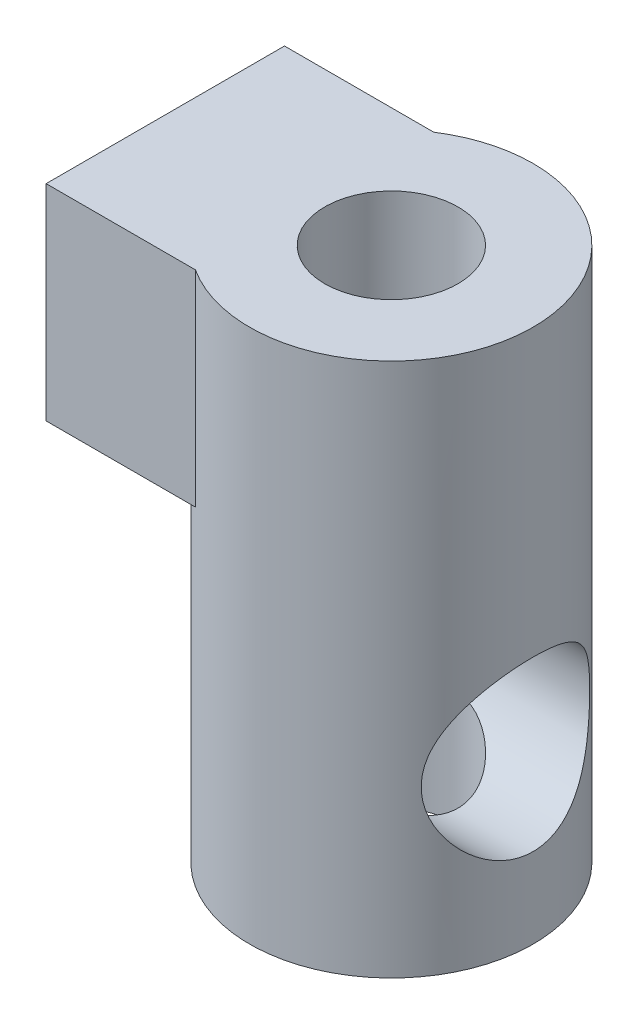
ISO-10303-21;
HEADER;
FILE_DESCRIPTION(('STEP AP214'),'2;1');
FILE_NAME('part.step','',(''),(''),'','','');
FILE_SCHEMA(('AUTOMOTIVE_DESIGN { 1 0 10303 214 1 1 1 1 }'));
ENDSEC;
DATA;
#1=APPLICATION_CONTEXT('core data for automotive mechanical design processes');
#2=APPLICATION_PROTOCOL_DEFINITION('international standard','automotive_design',2000,#1);
#3=PRODUCT_CONTEXT('',#1,'mechanical');
#4=PRODUCT('Part','Part','',(#3));
#5=PRODUCT_RELATED_PRODUCT_CATEGORY('part','',(#4));
#6=PRODUCT_DEFINITION_FORMATION('','',#4);
#7=PRODUCT_DEFINITION_CONTEXT('part definition',#1,'design');
#8=PRODUCT_DEFINITION('design','',#6,#7);
#9=PRODUCT_DEFINITION_SHAPE('','',#8);
#10=(LENGTH_UNIT() NAMED_UNIT(*) SI_UNIT(.MILLI.,.METRE.));
#11=(NAMED_UNIT(*) PLANE_ANGLE_UNIT() SI_UNIT($,.RADIAN.));
#12=(NAMED_UNIT(*) SI_UNIT($,.STERADIAN.) SOLID_ANGLE_UNIT());
#13=UNCERTAINTY_MEASURE_WITH_UNIT(LENGTH_MEASURE(1.E-05),#10,'distance_accuracy_value','');
#14=(GEOMETRIC_REPRESENTATION_CONTEXT(3) GLOBAL_UNCERTAINTY_ASSIGNED_CONTEXT((#13)) GLOBAL_UNIT_ASSIGNED_CONTEXT((#10,
#11,#12)) REPRESENTATION_CONTEXT('',''));
#15=CARTESIAN_POINT('',(0.,0.,0.));
#16=DIRECTION('',(0.,0.,1.));
#17=DIRECTION('',(1.,0.,0.));
#18=AXIS2_PLACEMENT_3D('',#15,#16,#17);
#19=CARTESIAN_POINT('',(-5.5,13.,2.9));
#20=DIRECTION('',(1.,0.,0.));
#21=DIRECTION('',(0.,1.,0.));
#22=AXIS2_PLACEMENT_3D('',#19,#20,#21);
#23=PLANE('',#22);
#24=DIRECTION('',(0.,1.,0.));
#25=VECTOR('',#24,1.);
#26=CARTESIAN_POINT('',(-5.5,0.,2.9));
#27=LINE('',#26,#25);
#28=CARTESIAN_POINT('',(-5.5,13.,2.9));
#29=VERTEX_POINT('',#28);
#30=CARTESIAN_POINT('',(-5.5,8.,2.9));
#31=VERTEX_POINT('',#30);
#32=EDGE_CURVE('E93',#29,#31,#27,.F.);
#33=ORIENTED_EDGE('',*,*,#32,.F.);
#34=DIRECTION('',(0.,0.,1.));
#35=VECTOR('',#34,1.);
#36=CARTESIAN_POINT('',(-5.5,13.,0.));
#37=LINE('',#36,#35);
#38=CARTESIAN_POINT('',(-5.5,13.,-2.9));
#39=VERTEX_POINT('',#38);
#40=EDGE_CURVE('E99',#39,#29,#37,.T.);
#41=ORIENTED_EDGE('',*,*,#40,.F.);
#42=DIRECTION('',(0.,1.,0.));
#43=VECTOR('',#42,1.);
#44=CARTESIAN_POINT('',(-5.5,0.,-2.9));
#45=LINE('',#44,#43);
#46=CARTESIAN_POINT('',(-5.5,8.,-2.9));
#47=VERTEX_POINT('',#46);
#48=EDGE_CURVE('E105',#39,#47,#45,.F.);
#49=ORIENTED_EDGE('',*,*,#48,.T.);
#50=DIRECTION('',(0.,0.,1.));
#51=VECTOR('',#50,1.);
#52=CARTESIAN_POINT('',(-5.5,8.,2.9));
#53=LINE('',#52,#51);
#54=EDGE_CURVE('E104',#47,#31,#53,.T.);
#55=ORIENTED_EDGE('',*,*,#54,.T.);
#56=EDGE_LOOP('',(#33,#41,#49,#55));
#57=FACE_BOUND('',#56,.T.);
#58=ADVANCED_FACE('F49',(#57),#23,.F.);
#59=CARTESIAN_POINT('',(0.,0.,0.));
#60=DIRECTION('',(0.,-1.,0.));
#61=DIRECTION('',(0.,0.,-1.));
#62=AXIS2_PLACEMENT_3D('',#59,#60,#61);
#63=CYLINDRICAL_SURFACE('',#62,1.621);
#64=CARTESIAN_POINT('',(0.,2.74506613720085,-1.621));
#65=CARTESIAN_POINT('',(-0.0618838344943444,2.74507314784713,-1.62100303795965));
#66=CARTESIAN_POINT('',(-0.123753923437036,2.74041001839376,-1.61742580648904));
#67=CARTESIAN_POINT('',(-0.245548077429936,2.72269820526634,-1.60347159765317));
#68=CARTESIAN_POINT('',(-0.305467583498045,2.70963117787796,-1.59307974460996));
#69=CARTESIAN_POINT('',(-0.441855724366991,2.67167549543974,-1.56167676736126));
#70=CARTESIAN_POINT('',(-0.517049098267742,2.64428105756333,-1.53826004055569));
#71=CARTESIAN_POINT('',(-0.661104506712128,2.58308809869082,-1.48209063959145));
#72=CARTESIAN_POINT('',(-0.729947369344123,2.54927107144414,-1.44931084533742));
#73=CARTESIAN_POINT('',(-0.883849864405583,2.46687093643185,-1.36260863239398));
#74=CARTESIAN_POINT('',(-0.966412860188457,2.41719066792417,-1.3052891068616));
#75=CARTESIAN_POINT('',(-1.11998184477946,2.31899579598461,-1.17614619810124));
#76=CARTESIAN_POINT('',(-1.19099722423979,2.2704802730153,-1.10433470749768));
#77=CARTESIAN_POINT('',(-1.30741448004819,2.1881341644896,-0.961795820520631));
#78=CARTESIAN_POINT('',(-1.35511379821205,2.15327812500301,-0.89354450203995));
#79=CARTESIAN_POINT('',(-1.44036943977302,2.08983985144661,-0.748356083631551));
#80=CARTESIAN_POINT('',(-1.47794136722123,2.06124797856644,-0.671432607974437));
#81=CARTESIAN_POINT('',(-1.53603227948987,2.01657637847978,-0.523019292399699));
#82=CARTESIAN_POINT('',(-1.5583110113087,1.99923126755153,-0.452603469122463));
#83=CARTESIAN_POINT('',(-1.5931987923943,1.97194135411511,-0.308021253672216));
#84=CARTESIAN_POINT('',(-1.60581302820809,1.96199258237375,-0.233856896000057));
#85=CARTESIAN_POINT('',(-1.62060784053911,1.95031520563182,-0.0835898288305419));
#86=CARTESIAN_POINT('',(-1.622754232398,1.94861353315467,-0.00748158339559628));
#87=CARTESIAN_POINT('',(-1.61637011622946,1.95365995743185,0.144000645385217));
#88=CARTESIAN_POINT('',(-1.60783889419273,1.96040861925788,0.219374579288185));
#89=CARTESIAN_POINT('',(-1.58137378064278,1.98120338027809,0.363292111490304));
#90=CARTESIAN_POINT('',(-1.56394382245725,1.99485804086783,0.431987821527844));
#91=CARTESIAN_POINT('',(-1.52089453282525,2.02825075136374,0.565176319537256));
#92=CARTESIAN_POINT('',(-1.4952731758384,2.04799030587785,0.629668063213476));
#93=CARTESIAN_POINT('',(-1.43398336321787,2.0945524951873,0.759600226458337));
#94=CARTESIAN_POINT('',(-1.39757254510311,2.12188213081783,0.824505291232971));
#95=CARTESIAN_POINT('',(-1.31735169849772,2.18078779889944,0.94742878237488));
#96=CARTESIAN_POINT('',(-1.27353705925498,2.21236647494132,1.00544287879559));
#97=CARTESIAN_POINT('',(-1.16981404388338,2.28487045121659,1.12547688073274));
#98=CARTESIAN_POINT('',(-1.10844780214715,2.32638463810277,1.18587950931886));
#99=CARTESIAN_POINT('',(-0.977264585306865,2.41023794800863,1.29612932641368));
#100=CARTESIAN_POINT('',(-0.907439330850794,2.45257784464318,1.34596604009144));
#101=CARTESIAN_POINT('',(-0.768475362298799,2.5294639393179,1.42927834909955));
#102=CARTESIAN_POINT('',(-0.700266704048141,2.56433465569014,1.46400152188266));
#103=CARTESIAN_POINT('',(-0.557319490299985,2.6283607645284,1.5241485765311));
#104=CARTESIAN_POINT('',(-0.482590989710123,2.65752474030309,1.54958647471164));
#105=CARTESIAN_POINT('',(-0.340404375629608,2.70115287710556,1.58624516610801));
#106=CARTESIAN_POINT('',(-0.273922199255208,2.71728655323593,1.59916336038962));
#107=CARTESIAN_POINT('',(-0.138281246217461,2.73922227563148,1.61652514107857));
#108=CARTESIAN_POINT('',(-0.0691320460858539,2.74505830542494,1.62099660621602));
#109=CARTESIAN_POINT('',(0.0618838344943545,2.74507314784709,1.62100303795965));
#110=CARTESIAN_POINT('',(0.123753923437046,2.74041001839375,1.61742580648904));
#111=CARTESIAN_POINT('',(0.245548077429942,2.72269820526635,1.60347159765317));
#112=CARTESIAN_POINT('',(0.305467583498048,2.70963117787797,1.59307974460996));
#113=CARTESIAN_POINT('',(0.44185572436699,2.67167549543974,1.56167676736126));
#114=CARTESIAN_POINT('',(0.51704909826774,2.64428105756332,1.53826004055569));
#115=CARTESIAN_POINT('',(0.661104506712126,2.58308809869082,1.48209063959145));
#116=CARTESIAN_POINT('',(0.729947369344122,2.54927107144414,1.44931084533743));
#117=CARTESIAN_POINT('',(0.883849864405583,2.46687093643185,1.36260863239398));
#118=CARTESIAN_POINT('',(0.966412860188457,2.41719066792417,1.3052891068616));
#119=CARTESIAN_POINT('',(1.11998184477946,2.31899579598461,1.17614619810124));
#120=CARTESIAN_POINT('',(1.19099722423979,2.2704802730153,1.10433470749768));
#121=CARTESIAN_POINT('',(1.30741448004819,2.1881341644896,0.961795820520632));
#122=CARTESIAN_POINT('',(1.35511379821205,2.15327812500301,0.893544502039951));
#123=CARTESIAN_POINT('',(1.44036943977302,2.08983985144661,0.748356083631551));
#124=CARTESIAN_POINT('',(1.47794136722123,2.06124797856644,0.671432607974438));
#125=CARTESIAN_POINT('',(1.53603227948987,2.01657637847978,0.523019292399699));
#126=CARTESIAN_POINT('',(1.5583110113087,1.99923126755153,0.452603469122464));
#127=CARTESIAN_POINT('',(1.5931987923943,1.97194135411511,0.308021253672216));
#128=CARTESIAN_POINT('',(1.60581302820809,1.96199258237375,0.233856896000058));
#129=CARTESIAN_POINT('',(1.62060784053911,1.95031520563182,0.0835898288305418));
#130=CARTESIAN_POINT('',(1.622754232398,1.94861353315467,0.00748158339559626));
#131=CARTESIAN_POINT('',(1.61637011622946,1.95365995743185,-0.144000645385217));
#132=CARTESIAN_POINT('',(1.60783889419273,1.96040861925788,-0.219374579288185));
#133=CARTESIAN_POINT('',(1.58137378064278,1.98120338027809,-0.363292111490305));
#134=CARTESIAN_POINT('',(1.56394382245725,1.99485804086783,-0.431987821527845));
#135=CARTESIAN_POINT('',(1.52089453282525,2.02825075136374,-0.565176319537257));
#136=CARTESIAN_POINT('',(1.4952731758384,2.04799030587785,-0.629668063213477));
#137=CARTESIAN_POINT('',(1.43398336321787,2.0945524951873,-0.759600226458337));
#138=CARTESIAN_POINT('',(1.39757254510311,2.12188213081783,-0.824505291232972));
#139=CARTESIAN_POINT('',(1.31735169849772,2.18078779889944,-0.94742878237488));
#140=CARTESIAN_POINT('',(1.27353705925498,2.21236647494132,-1.00544287879559));
#141=CARTESIAN_POINT('',(1.16981404388338,2.28487045121659,-1.12547688073274));
#142=CARTESIAN_POINT('',(1.10844780214715,2.32638463810277,-1.18587950931886));
#143=CARTESIAN_POINT('',(0.977264585306865,2.41023794800863,-1.29612932641368));
#144=CARTESIAN_POINT('',(0.907439330850794,2.45257784464318,-1.34596604009144));
#145=CARTESIAN_POINT('',(0.768475362298799,2.5294639393179,-1.42927834909955));
#146=CARTESIAN_POINT('',(0.700266704048141,2.56433465569014,-1.46400152188266));
#147=CARTESIAN_POINT('',(0.557319490299986,2.6283607645284,-1.5241485765311));
#148=CARTESIAN_POINT('',(0.482590989710123,2.65752474030309,-1.54958647471164));
#149=CARTESIAN_POINT('',(0.340404375629609,2.70115287710556,-1.58624516610801));
#150=CARTESIAN_POINT('',(0.273922199255209,2.71728655323592,-1.59916336038962));
#151=CARTESIAN_POINT('',(0.138281246217465,2.73922227563149,-1.61652514107857));
#152=CARTESIAN_POINT('',(0.0691320460858616,2.74505830542497,-1.62099660621601));
#153=CARTESIAN_POINT('',(0.,2.74506613720085,-1.621));
#154=B_SPLINE_CURVE_WITH_KNOTS('',3,(#64,#65,#66,#67,#68,#69,#70,#71,#72,#73,#74,#75,#76,#77,
#78,#79,#80,#81,#82,#83,#84,#85,#86,#87,#88,#89,#90,#91,#92,#93,#94,#95,#96,#97,#98,#99,#100,
#101,#102,#103,#104,#105,#106,#107,#108,#109,#110,#111,#112,#113,#114,#115,#116,#117,#118,#119,
#120,#121,#122,#123,#124,#125,#126,#127,#128,#129,#130,#131,#132,#133,#134,#135,#136,#137,#138,
#139,#140,#141,#142,#143,#144,#145,#146,#147,#148,#149,#150,#151,#152,#153),.UNSPECIFIED.,.T.,
.F.,(4,2,2,2,2,2,2,2,2,2,2,2,2,2,2,2,2,2,2,2,2,2,2,2,2,2,2,2,2,2,2,2,2,2,2,2,2,2,2,2,2,2,2,2,4),
(0.,0.185377660843626,0.371161336779442,0.619921094874963,0.869408821243559,1.20414561890691,
1.53860882854341,1.80839015749153,2.07775340616949,2.30438341449147,2.53089171422933,
2.75813922518544,2.98540193293617,3.20102541609755,3.41670225917006,3.6536797749335,
3.89080541674557,4.17654691448938,4.46257037937714,4.71414744690372,4.96534316757062,
5.17312037153082,5.38021059303127,5.56558825387489,5.7513719298107,6.00013168790622,
6.24961941427482,6.58435621193817,6.91881942157467,7.18860075052279,7.45796399920074,
7.68459400752272,7.91110230726059,8.1383498182167,8.36561252596742,8.58123600912881,
8.79691285220132,9.03389036796475,9.27101600977683,9.55675750752064,9.8427809724084,
10.094358039935,10.3455537606019,10.5533309645621,10.7604211860625),.UNSPECIFIED.);
#155=CARTESIAN_POINT('',(0.,2.74506613720085,-1.621));
#156=VERTEX_POINT('',#155);
#157=EDGE_CURVE('E52',#156,#156,#154,.T.);
#158=ORIENTED_EDGE('',*,*,#157,.T.);
#159=EDGE_LOOP('',(#158));
#160=FACE_BOUND('',#159,.T.);
#161=CARTESIAN_POINT('',(0.,0.,0.));
#162=DIRECTION('',(0.,-1.,0.));
#163=DIRECTION('',(0.,0.,-1.));
#164=AXIS2_PLACEMENT_3D('',#161,#162,#163);
#165=CIRCLE('',#164,1.621);
#166=CARTESIAN_POINT('',(0.,0.,-1.621));
#167=VERTEX_POINT('',#166);
#168=EDGE_CURVE('E123',#167,#167,#165,.T.);
#169=ORIENTED_EDGE('',*,*,#168,.T.);
#170=EDGE_LOOP('',(#169));
#171=FACE_BOUND('',#170,.T.);
#172=ADVANCED_FACE('F183',(#160,#171),#63,.F.);
#173=CARTESIAN_POINT('',(0.,0.,2.9));
#174=DIRECTION('',(0.,0.,1.));
#175=DIRECTION('',(1.,0.,0.));
#176=AXIS2_PLACEMENT_3D('',#173,#174,#175);
#177=PLANE('',#176);
#178=DIRECTION('',(0.,-1.,0.));
#179=VECTOR('',#178,1.);
#180=CARTESIAN_POINT('',(-1.86882315910308,13.,2.9));
#181=LINE('',#180,#179);
#182=CARTESIAN_POINT('',(-1.86882315910308,13.,2.9));
#183=VERTEX_POINT('',#182);
#184=CARTESIAN_POINT('',(-1.86882315910308,8.,2.9));
#185=VERTEX_POINT('',#184);
#186=EDGE_CURVE('E122',#183,#185,#181,.T.);
#187=ORIENTED_EDGE('',*,*,#186,.F.);
#188=DIRECTION('',(1.,0.,0.));
#189=VECTOR('',#188,1.);
#190=CARTESIAN_POINT('',(0.,13.,2.9));
#191=LINE('',#190,#189);
#192=EDGE_CURVE('E110',#29,#183,#191,.T.);
#193=ORIENTED_EDGE('',*,*,#192,.F.);
#194=ORIENTED_EDGE('',*,*,#32,.T.);
#195=DIRECTION('',(1.,0.,0.));
#196=VECTOR('',#195,1.);
#197=CARTESIAN_POINT('',(-5.5,8.,2.9));
#198=LINE('',#197,#196);
#199=EDGE_CURVE('E83',#31,#185,#198,.T.);
#200=ORIENTED_EDGE('',*,*,#199,.T.);
#201=EDGE_LOOP('',(#187,#193,#194,#200));
#202=FACE_BOUND('',#201,.T.);
#203=ADVANCED_FACE('F109',(#202),#177,.T.);
#204=CARTESIAN_POINT('',(-5.5,8.,2.9));
#205=DIRECTION('',(0.,1.,0.));
#206=DIRECTION('',(0.,0.,1.));
#207=AXIS2_PLACEMENT_3D('',#204,#205,#206);
#208=PLANE('',#207);
#209=ORIENTED_EDGE('',*,*,#199,.F.);
#210=ORIENTED_EDGE('',*,*,#54,.F.);
#211=DIRECTION('',(1.,0.,0.));
#212=VECTOR('',#211,1.);
#213=CARTESIAN_POINT('',(0.,8.,-2.9));
#214=LINE('',#213,#212);
#215=CARTESIAN_POINT('',(-1.86882315910308,8.,-2.9));
#216=VERTEX_POINT('',#215);
#217=EDGE_CURVE('E117',#47,#216,#214,.T.);
#218=ORIENTED_EDGE('',*,*,#217,.T.);
#219=CARTESIAN_POINT('',(0.,8.,0.));
#220=DIRECTION('',(0.,-1.,0.));
#221=DIRECTION('',(0.,0.,-1.));
#222=AXIS2_PLACEMENT_3D('',#219,#220,#221);
#223=CIRCLE('',#222,3.45);
#224=EDGE_CURVE('E115',#185,#216,#223,.T.);
#225=ORIENTED_EDGE('',*,*,#224,.F.);
#226=EDGE_LOOP('',(#209,#210,#218,#225));
#227=FACE_BOUND('',#226,.T.);
#228=ADVANCED_FACE('F113',(#227),#208,.F.);
#229=CARTESIAN_POINT('',(0.,0.,-2.9));
#230=DIRECTION('',(0.,0.,1.));
#231=DIRECTION('',(1.,0.,0.));
#232=AXIS2_PLACEMENT_3D('',#229,#230,#231);
#233=PLANE('',#232);
#234=ORIENTED_EDGE('',*,*,#217,.F.);
#235=ORIENTED_EDGE('',*,*,#48,.F.);
#236=DIRECTION('',(1.,0.,0.));
#237=VECTOR('',#236,1.);
#238=CARTESIAN_POINT('',(0.,13.,-2.9));
#239=LINE('',#238,#237);
#240=CARTESIAN_POINT('',(-1.86882315910308,13.,-2.9));
#241=VERTEX_POINT('',#240);
#242=EDGE_CURVE('E175',#241,#39,#239,.F.);
#243=ORIENTED_EDGE('',*,*,#242,.F.);
#244=DIRECTION('',(0.,-1.,0.));
#245=VECTOR('',#244,1.);
#246=CARTESIAN_POINT('',(-1.86882315910308,13.,-2.9));
#247=LINE('',#246,#245);
#248=EDGE_CURVE('E177',#216,#241,#247,.F.);
#249=ORIENTED_EDGE('',*,*,#248,.F.);
#250=EDGE_LOOP('',(#234,#235,#243,#249));
#251=FACE_BOUND('',#250,.T.);
#252=ADVANCED_FACE('F162',(#251),#233,.F.);
#253=CARTESIAN_POINT('',(-3.45,4.,0.));
#254=DIRECTION('',(1.,0.,0.));
#255=DIRECTION('',(0.,0.,-1.));
#256=AXIS2_PLACEMENT_3D('',#253,#254,#255);
#257=CYLINDRICAL_SURFACE('',#256,2.05);
#258=CARTESIAN_POINT('',(0.,5.25493386279916,1.62099999999999));
#259=CARTESIAN_POINT('',(-0.061883033049549,5.25492889918169,1.62100214032641));
#260=CARTESIAN_POINT('',(-0.123755996479579,5.25959073995909,1.61742540841188));
#261=CARTESIAN_POINT('',(-0.245551219828907,5.27730179462163,1.60347139817653));
#262=CARTESIAN_POINT('',(-0.30546900533672,5.29036899863706,1.59307953238345));
#263=CARTESIAN_POINT('',(-0.441854610423959,5.32832448802651,1.56167686966186));
#264=CARTESIAN_POINT('',(-0.517047347609583,5.35571839087183,1.53826053845071));
#265=CARTESIAN_POINT('',(-0.661103028524226,5.41691108038444,1.48209140158255));
#266=CARTESIAN_POINT('',(-0.729946653059148,5.45072851563303,1.44931126805409));
#267=CARTESIAN_POINT('',(-0.883850180507783,5.53312927228377,1.36260842856593));
#268=CARTESIAN_POINT('',(-0.966413492435413,5.58280972225945,1.30528866079276));
#269=CARTESIAN_POINT('',(-1.11998239987942,5.68100457275356,1.17614564592379));
#270=CARTESIAN_POINT('',(-1.19099747457449,5.72951990147346,1.10433440354057));
#271=CARTESIAN_POINT('',(-1.30741442747507,5.8118658004062,0.961795882835193));
#272=CARTESIAN_POINT('',(-1.35511370389337,5.84672180667136,0.893544636434797));
#273=CARTESIAN_POINT('',(-1.44036936613832,5.91016009190644,0.748356235158539));
#274=CARTESIAN_POINT('',(-1.4779413362639,5.93875199748061,0.671432687310931));
#275=CARTESIAN_POINT('',(-1.53603229081255,5.98342363035093,0.523019263265586));
#276=CARTESIAN_POINT('',(-1.55831103038849,6.00076874732406,0.452603408683053));
#277=CARTESIAN_POINT('',(-1.59319880325188,6.02805865442715,0.308021190085523));
#278=CARTESIAN_POINT('',(-1.60581303133965,6.03800742010654,0.233856863808264));
#279=CARTESIAN_POINT('',(-1.6206078367329,6.0496847913554,0.0835898678755997));
#280=CARTESIAN_POINT('',(-1.62275423035395,6.0513864651685,0.00748166244067007));
#281=CARTESIAN_POINT('',(-1.616370124903,6.04634004948564,-0.144000567138135));
#282=CARTESIAN_POINT('',(-1.60783890077889,6.03959138617865,-0.21937454107455));
#283=CARTESIAN_POINT('',(-1.58137378012163,6.01879661906433,-0.363292116599426));
#284=CARTESIAN_POINT('',(-1.56394382140614,6.00514195739511,-0.431987831327662));
#285=CARTESIAN_POINT('',(-1.52089452760981,5.97174924550825,-0.565176329128339));
#286=CARTESIAN_POINT('',(-1.49527316817564,5.95200969156516,-0.629668068517935));
#287=CARTESIAN_POINT('',(-1.43398316810272,5.90544735299585,-0.759600652116186));
#288=CARTESIAN_POINT('',(-1.39757211222425,5.87811753048299,-0.824506101761588));
#289=CARTESIAN_POINT('',(-1.31735112292729,5.81921179934006,-0.947429516871564));
#290=CARTESIAN_POINT('',(-1.27353667123426,5.78763330016539,-1.00544323928693));
#291=CARTESIAN_POINT('',(-1.16981732669034,5.71513178767887,-1.12547318838376));
#292=CARTESIAN_POINT('',(-1.10845512396213,5.67362009730251,-1.18587266023303));
#293=CARTESIAN_POINT('',(-0.977271968834751,5.58976671268696,-1.29612381826176));
#294=CARTESIAN_POINT('',(-0.907441796666578,5.54742415661406,-1.34596384240431));
#295=CARTESIAN_POINT('',(-0.768454020406526,5.47052369220059,-1.42929177700902));
#296=CARTESIAN_POINT('',(-0.700224043684187,5.4356417709281,-1.46402500173882));
#297=CARTESIAN_POINT('',(-0.557261588228809,5.37161775450909,-1.52416742519672));
#298=CARTESIAN_POINT('',(-0.482543855505317,5.34246311004278,-1.54959711730513));
#299=CARTESIAN_POINT('',(-0.3488371866511,5.30143295920477,-1.58407209628777));
#300=CARTESIAN_POINT('',(-0.291322382051614,5.28700429614235,-1.59571297827185));
#301=CARTESIAN_POINT('',(-0.174053268851574,5.26564342969819,-1.61271180043318));
#302=CARTESIAN_POINT('',(-0.114303858671364,5.2586957218473,-1.61808273718418));
#303=CARTESIAN_POINT('',(0.00610377366413646,5.25350316750355,-1.62211120435333));
#304=CARTESIAN_POINT('',(0.0667649395882279,5.25529918211992,-1.62073721417151));
#305=CARTESIAN_POINT('',(0.186743463703107,5.26733881274003,-1.61133604094995));
#306=CARTESIAN_POINT('',(0.246058688971207,5.27759498939371,-1.60329896525788));
#307=CARTESIAN_POINT('',(0.378029533759794,5.3086510349792,-1.57810805759646));
#308=CARTESIAN_POINT('',(0.449797430601424,5.33159241834356,-1.55903801762583));
#309=CARTESIAN_POINT('',(0.587877981473662,5.38432475684989,-1.51241015736106));
#310=CARTESIAN_POINT('',(0.654174078509454,5.41413553515476,-1.48482769286972));
#311=CARTESIAN_POINT('',(0.807953506978126,5.49046420986335,-1.40889626274167));
#312=CARTESIAN_POINT('',(0.89265594334417,5.53874411889626,-1.35668986630306));
#313=CARTESIAN_POINT('',(1.05111007655166,5.63578929914672,-1.23798499705547));
#314=CARTESIAN_POINT('',(1.12485035324314,5.68455502083611,-1.17147179373758));
#315=CARTESIAN_POINT('',(1.26089163408736,5.77827631797998,-1.02370473941556));
#316=CARTESIAN_POINT('',(1.32307401507183,5.82319007901757,-0.942313406154192));
#317=CARTESIAN_POINT('',(1.43228266169034,5.9039303077775,-0.766070062745339));
#318=CARTESIAN_POINT('',(1.47935885986475,5.93978662887907,-0.671263923785083));
#319=CARTESIAN_POINT('',(1.54261773466839,5.98853499246691,-0.503220178930186));
#320=CARTESIAN_POINT('',(1.5638679604424,6.00510346159556,-0.432938636689425));
#321=CARTESIAN_POINT('',(1.59676230394664,6.03086230537072,-0.288851051988581));
#322=CARTESIAN_POINT('',(1.60841361450421,6.04005820442156,-0.215047692512681));
#323=CARTESIAN_POINT('',(1.62140422788307,6.05031577543763,-0.0657382658470275));
#324=CARTESIAN_POINT('',(1.62271209859861,6.05135265335801,0.00977229260505802));
#325=CARTESIAN_POINT('',(1.61484481788687,6.04513496258799,0.159901550024474));
#326=CARTESIAN_POINT('',(1.60566812622582,6.0378791756643,0.234520116326395));
#327=CARTESIAN_POINT('',(1.57803936732592,6.01618411472832,0.377509343320892));
#328=CARTESIAN_POINT('',(1.56000044842438,6.00206508275369,0.446010733770843));
#329=CARTESIAN_POINT('',(1.51579057609565,5.96781229907152,0.578720243658588));
#330=CARTESIAN_POINT('',(1.48961756773055,5.94767702751408,0.642927273213235));
#331=CARTESIAN_POINT('',(1.42708423145257,5.90025501239669,0.772511008436384));
#332=CARTESIAN_POINT('',(1.38994864417285,5.87244300789281,0.837317804438033));
#333=CARTESIAN_POINT('',(1.30827504950294,5.81264140107754,0.959944811141948));
#334=CARTESIAN_POINT('',(1.2637321230162,5.78064902569327,1.01776033468806));
#335=CARTESIAN_POINT('',(1.15829718368978,5.70727405147842,1.13736467721005));
#336=CARTESIAN_POINT('',(1.09592944450333,5.66531836035746,1.19749944593213));
#337=CARTESIAN_POINT('',(0.962663407540082,5.58079323638569,1.30704831575405));
#338=CARTESIAN_POINT('',(0.89175737698168,5.53822327839336,1.35645258342963));
#339=CARTESIAN_POINT('',(0.752359411390864,5.46218916203854,1.43775553281014));
#340=CARTESIAN_POINT('',(0.684976630172156,5.42829414723995,1.47114807536486));
#341=CARTESIAN_POINT('',(0.543932986788265,5.36628181427758,1.52890945878704));
#342=CARTESIAN_POINT('',(0.470282855947681,5.3381548905017,1.55329335696118));
#343=CARTESIAN_POINT('',(0.330952795152718,5.29646665225007,1.58817023124629));
#344=CARTESIAN_POINT('',(0.266239164139942,5.28119135627848,1.60037755212961));
#345=CARTESIAN_POINT('',(0.134341167077994,5.2604420451946,1.61677950974833));
#346=CARTESIAN_POINT('',(0.0671646526277056,5.25493925005358,1.62099767700008));
#347=CARTESIAN_POINT('',(0.,5.25493386279916,1.62099999999999));
#348=B_SPLINE_CURVE_WITH_KNOTS('',3,(#258,#259,#260,#261,#262,#263,#264,#265,#266,#267,#268,
#269,#270,#271,#272,#273,#274,#275,#276,#277,#278,#279,#280,#281,#282,#283,#284,#285,#286,#287,
#288,#289,#290,#291,#292,#293,#294,#295,#296,#297,#298,#299,#300,#301,#302,#303,#304,#305,#306,
#307,#308,#309,#310,#311,#312,#313,#314,#315,#316,#317,#318,#319,#320,#321,#322,#323,#324,#325,
#326,#327,#328,#329,#330,#331,#332,#333,#334,#335,#336,#337,#338,#339,#340,#341,#342,#343,#344,
#345,#346,#347),.UNSPECIFIED.,.T.,.F.,(4,2,2,2,2,2,2,2,2,2,2,2,2,2,2,2,2,2,2,2,2,2,2,2,2,2,2,2,
2,2,2,2,2,2,2,2,2,2,2,2,2,2,2,2,4),(0.,0.185381616549972,0.371161334490022,0.619918309503557,
0.869408821531492,1.20414690848627,1.53860882897815,1.80838989326253,2.07775340646692,
2.30438351163773,2.53089171455724,2.75813910800171,2.98540193327238,3.20102543208312,
3.41670225950147,3.6536812612653,3.89080541659522,4.17653093149088,4.46257038034193,
4.71423568196704,4.9653432410954,5.14594567536399,5.32617308175894,5.50724353198713,
5.68858329913331,5.92044827887146,6.15299092654559,6.48309963883761,6.81354987714127,
7.14722406649036,7.47978367546371,7.70466158107009,7.92937082356064,8.15476266111802,
8.38018761410257,8.59597889835669,8.81182474294718,9.05006699291498,9.28846809225648,
9.57620848530387,9.86421146121221,10.1109589542016,10.3572921402497,10.5590910762084,
10.7602947222735),.UNSPECIFIED.);
#349=CARTESIAN_POINT('',(0.,5.25493386279916,1.62099999999999));
#350=VERTEX_POINT('',#349);
#351=EDGE_CURVE('E111',#350,#350,#348,.T.);
#352=ORIENTED_EDGE('',*,*,#351,.F.);
#353=EDGE_LOOP('',(#352));
#354=FACE_BOUND('',#353,.T.);
#355=CARTESIAN_POINT('',(-2.77488738510232,4.,2.05));
#356=CARTESIAN_POINT('',(-2.77489143393681,3.89663578491721,2.04999751277487));
#357=CARTESIAN_POINT('',(-2.78075382388587,3.79325437500086,2.04212997172924));
#358=CARTESIAN_POINT('',(-2.80319095394179,3.58994792576057,2.01120947430331));
#359=CARTESIAN_POINT('',(-2.81977869035129,3.49002723488545,1.98813809421198));
#360=CARTESIAN_POINT('',(-2.86099956660419,3.29702527173235,1.92833464247161));
#361=CARTESIAN_POINT('',(-2.88557503963835,3.20390066769099,1.89170023193819));
#362=CARTESIAN_POINT('',(-2.93990031601834,3.02517778436712,1.80611491729768));
#363=CARTESIAN_POINT('',(-2.96965169787961,2.93958181314335,1.75716025379903));
#364=CARTESIAN_POINT('',(-3.03528078749033,2.7671024794558,1.6414925013206));
#365=CARTESIAN_POINT('',(-3.07146557480204,2.68129069370902,1.57335539137369));
#366=CARTESIAN_POINT('',(-3.14341900615699,2.52142663611085,1.42417854055656));
#367=CARTESIAN_POINT('',(-3.17918733183335,2.44738287522702,1.3431295455101));
#368=CARTESIAN_POINT('',(-3.2507454613309,2.30545318258062,1.16007998696332));
#369=CARTESIAN_POINT('',(-3.28614148760711,2.23903504295877,1.0567721935483));
#370=CARTESIAN_POINT('',(-3.34861893795642,2.12502685242944,0.837945244070723));
#371=CARTESIAN_POINT('',(-3.37570778937931,2.07741997153734,0.722437121164436));
#372=CARTESIAN_POINT('',(-3.41623599660832,2.00716061371986,0.493963332768772));
#373=CARTESIAN_POINT('',(-3.43071920770604,1.98258277834576,0.381779664167375));
#374=CARTESIAN_POINT('',(-3.44844472323343,1.95258064813637,0.15404091057593));
#375=CARTESIAN_POINT('',(-3.45169733581108,1.94713878901676,0.0384890154691252));
#376=CARTESIAN_POINT('',(-3.44691481696331,1.95519688732065,-0.1775459264577));
#377=CARTESIAN_POINT('',(-3.44020504576054,1.96647253351257,-0.278151654723405));
#378=CARTESIAN_POINT('',(-3.41848665906978,2.00343417951739,-0.475736996500932));
#379=CARTESIAN_POINT('',(-3.40347743245066,2.02912124051813,-0.572716342422266));
#380=CARTESIAN_POINT('',(-3.36634053642459,2.09396822032481,-0.761287110846904));
#381=CARTESIAN_POINT('',(-3.34416736999643,2.13321436417511,-0.852839547639698));
#382=CARTESIAN_POINT('',(-3.2944893894688,2.22374246175478,-1.02818050469654));
#383=CARTESIAN_POINT('',(-3.26698314463927,2.27502764603403,-1.11196693260147));
#384=CARTESIAN_POINT('',(-3.20515249271778,2.39502128496743,-1.28001118436979));
#385=CARTESIAN_POINT('',(-3.17040647450803,2.46507266408615,-1.36315408489345));
#386=CARTESIAN_POINT('',(-3.0996413791566,2.61713706063045,-1.51721046681026));
#387=CARTESIAN_POINT('',(-3.06362066198332,2.69916594617044,-1.58810744818468));
#388=CARTESIAN_POINT('',(-2.98963648835672,2.88380968978909,-1.72371128858937));
#389=CARTESIAN_POINT('',(-2.95191066711962,2.98770239727529,-1.78682336885537));
#390=CARTESIAN_POINT('',(-2.88410862163228,3.20699389859274,-1.89432845584547));
#391=CARTESIAN_POINT('',(-2.85401817581997,3.32237073552277,-1.93875636651866));
#392=CARTESIAN_POINT('',(-2.81275685809301,3.53167775826355,-1.99796367759949));
#393=CARTESIAN_POINT('',(-2.79873407253478,3.62373335929514,-2.01738359688765));
#394=CARTESIAN_POINT('',(-2.77980209532251,3.81052303228283,-2.0433964025447));
#395=CARTESIAN_POINT('',(-2.77488367385963,3.90525429265861,-2.05000227984031));
#396=CARTESIAN_POINT('',(-2.77489143393681,4.10336421508279,-2.04999751277487));
#397=CARTESIAN_POINT('',(-2.78075382388587,4.20674562499914,-2.04212997172924));
#398=CARTESIAN_POINT('',(-2.80319095394179,4.41005207423943,-2.01120947430331));
#399=CARTESIAN_POINT('',(-2.81977869035129,4.50997276511455,-1.98813809421198));
#400=CARTESIAN_POINT('',(-2.86099956660419,4.70297472826765,-1.92833464247161));
#401=CARTESIAN_POINT('',(-2.88557503963835,4.79609933230901,-1.89170023193819));
#402=CARTESIAN_POINT('',(-2.93990031601834,4.97482221563288,-1.80611491729768));
#403=CARTESIAN_POINT('',(-2.96965169787961,5.06041818685665,-1.75716025379903));
#404=CARTESIAN_POINT('',(-3.03528078749033,5.2328975205442,-1.6414925013206));
#405=CARTESIAN_POINT('',(-3.07146557480204,5.31870930629098,-1.57335539137369));
#406=CARTESIAN_POINT('',(-3.14341900615699,5.47857336388915,-1.42417854055656));
#407=CARTESIAN_POINT('',(-3.17918733183335,5.55261712477298,-1.3431295455101));
#408=CARTESIAN_POINT('',(-3.2507454613309,5.69454681741938,-1.16007998696332));
#409=CARTESIAN_POINT('',(-3.28614148760711,5.76096495704123,-1.0567721935483));
#410=CARTESIAN_POINT('',(-3.34861893795642,5.87497314757056,-0.837945244070723));
#411=CARTESIAN_POINT('',(-3.37570778937931,5.92258002846266,-0.722437121164437));
#412=CARTESIAN_POINT('',(-3.41623599660832,5.99283938628014,-0.493963332768773));
#413=CARTESIAN_POINT('',(-3.43071920770604,6.01741722165424,-0.381779664167376));
#414=CARTESIAN_POINT('',(-3.44844472323343,6.04741935186363,-0.15404091057593));
#415=CARTESIAN_POINT('',(-3.45169733581108,6.05286121098324,-0.0384890154691254));
#416=CARTESIAN_POINT('',(-3.44691481696331,6.04480311267935,0.1775459264577));
#417=CARTESIAN_POINT('',(-3.44020504576054,6.03352746648743,0.278151654723405));
#418=CARTESIAN_POINT('',(-3.41848665906978,5.99656582048261,0.475736996500931));
#419=CARTESIAN_POINT('',(-3.40347743245066,5.97087875948187,0.572716342422265));
#420=CARTESIAN_POINT('',(-3.36634053642459,5.90603177967519,0.761287110846903));
#421=CARTESIAN_POINT('',(-3.34416736999643,5.86678563582489,0.852839547639697));
#422=CARTESIAN_POINT('',(-3.2944893894688,5.77625753824522,1.02818050469654));
#423=CARTESIAN_POINT('',(-3.26698314463927,5.72497235396597,1.11196693260147));
#424=CARTESIAN_POINT('',(-3.20515249271778,5.60497871503257,1.28001118436979));
#425=CARTESIAN_POINT('',(-3.17040647450803,5.53492733591385,1.36315408489345));
#426=CARTESIAN_POINT('',(-3.0996413791566,5.38286293936956,1.51721046681026));
#427=CARTESIAN_POINT('',(-3.06362066198332,5.30083405382956,1.58810744818468));
#428=CARTESIAN_POINT('',(-2.98963648835672,5.11619031021091,1.72371128858937));
#429=CARTESIAN_POINT('',(-2.95191066711962,5.01229760272471,1.78682336885537));
#430=CARTESIAN_POINT('',(-2.88410862163228,4.79300610140726,1.89432845584547));
#431=CARTESIAN_POINT('',(-2.85401817581997,4.67762926447723,1.93875636651866));
#432=CARTESIAN_POINT('',(-2.81275685809301,4.46832224173645,1.99796367759949));
#433=CARTESIAN_POINT('',(-2.79873407253478,4.37626664070486,2.01738359688765));
#434=CARTESIAN_POINT('',(-2.77980209532251,4.18947696771717,2.0433964025447));
#435=CARTESIAN_POINT('',(-2.77488367385963,4.09474570734139,2.05000227984031));
#436=CARTESIAN_POINT('',(-2.77488738510232,4.,2.05));
#437=B_SPLINE_CURVE_WITH_KNOTS('',3,(#355,#356,#357,#358,#359,#360,#361,#362,#363,#364,#365,
#366,#367,#368,#369,#370,#371,#372,#373,#374,#375,#376,#377,#378,#379,#380,#381,#382,#383,#384,
#385,#386,#387,#388,#389,#390,#391,#392,#393,#394,#395,#396,#397,#398,#399,#400,#401,#402,#403,
#404,#405,#406,#407,#408,#409,#410,#411,#412,#413,#414,#415,#416,#417,#418,#419,#420,#421,#422,
#423,#424,#425,#426,#427,#428,#429,#430,#431,#432,#433,#434,#435,#436),.UNSPECIFIED.,.T.,.F.,(4,
2,2,2,2,2,2,2,2,2,2,2,2,2,2,2,2,2,2,2,2,2,2,2,2,2,2,2,2,2,2,2,2,2,2,2,2,2,2,2,4),(0.,
0.309689114216517,0.619754195345794,0.92762873895306,1.23559734128545,1.58041776661659,
1.9254864519965,2.30686498648646,2.68790153390397,3.03311352973234,3.37800858397734,
3.68093596068288,3.9838856464437,4.28879843546481,4.59379313834417,4.93483887836356,
5.27634061466023,5.65627826045167,6.03550295651628,6.31965842273558,6.60352566014335,
6.91321477435987,7.22327985548914,7.53115439909641,7.8391230014288,8.18394342675994,
8.52901211213985,8.91039064662981,9.29142719404732,9.63663918987569,9.98153424412068,
10.2844616208262,10.5874113065871,10.8923240956082,11.1973187984875,11.5383645385069,
11.8798662748036,12.259803920595,12.6390286166596,12.9231840828789,13.2070513202867),.UNSPECIFIED.);
#438=CARTESIAN_POINT('',(-2.77488738510232,4.,2.05));
#439=VERTEX_POINT('',#438);
#440=EDGE_CURVE('E134',#439,#439,#437,.T.);
#441=ORIENTED_EDGE('',*,*,#440,.F.);
#442=EDGE_LOOP('',(#441));
#443=FACE_BOUND('',#442,.T.);
#444=CARTESIAN_POINT('',(2.77488738510232,4.,-2.05));
#445=CARTESIAN_POINT('',(2.77489143393681,3.89663578491721,-2.04999751277487));
#446=CARTESIAN_POINT('',(2.78075382388587,3.79325437500086,-2.04212997172924));
#447=CARTESIAN_POINT('',(2.80319095394179,3.58994792576057,-2.01120947430331));
#448=CARTESIAN_POINT('',(2.81977869035129,3.49002723488545,-1.98813809421198));
#449=CARTESIAN_POINT('',(2.86099956660419,3.29702527173235,-1.92833464247161));
#450=CARTESIAN_POINT('',(2.88557503963835,3.20390066769099,-1.89170023193819));
#451=CARTESIAN_POINT('',(2.93990031601834,3.02517778436712,-1.80611491729768));
#452=CARTESIAN_POINT('',(2.96965169787961,2.93958181314335,-1.75716025379903));
#453=CARTESIAN_POINT('',(3.03528078749033,2.7671024794558,-1.6414925013206));
#454=CARTESIAN_POINT('',(3.07146557480204,2.68129069370902,-1.57335539137369));
#455=CARTESIAN_POINT('',(3.14341900615699,2.52142663611085,-1.42417854055656));
#456=CARTESIAN_POINT('',(3.17918733183335,2.44738287522702,-1.3431295455101));
#457=CARTESIAN_POINT('',(3.2507454613309,2.30545318258062,-1.16007998696332));
#458=CARTESIAN_POINT('',(3.28614148760711,2.23903504295877,-1.0567721935483));
#459=CARTESIAN_POINT('',(3.34861893795642,2.12502685242944,-0.837945244070723));
#460=CARTESIAN_POINT('',(3.37570778937931,2.07741997153734,-0.722437121164436));
#461=CARTESIAN_POINT('',(3.41623599660832,2.00716061371986,-0.493963332768772));
#462=CARTESIAN_POINT('',(3.43071920770604,1.98258277834576,-0.381779664167375));
#463=CARTESIAN_POINT('',(3.44844472323343,1.95258064813637,-0.15404091057593));
#464=CARTESIAN_POINT('',(3.45169733581108,1.94713878901676,-0.0384890154691252));
#465=CARTESIAN_POINT('',(3.44691481696331,1.95519688732065,0.1775459264577));
#466=CARTESIAN_POINT('',(3.44020504576054,1.96647253351257,0.278151654723405));
#467=CARTESIAN_POINT('',(3.41848665906978,2.00343417951739,0.475736996500932));
#468=CARTESIAN_POINT('',(3.40347743245066,2.02912124051813,0.572716342422266));
#469=CARTESIAN_POINT('',(3.36634053642459,2.09396822032481,0.761287110846904));
#470=CARTESIAN_POINT('',(3.34416736999643,2.13321436417511,0.852839547639698));
#471=CARTESIAN_POINT('',(3.2944893894688,2.22374246175478,1.02818050469654));
#472=CARTESIAN_POINT('',(3.26698314463927,2.27502764603403,1.11196693260147));
#473=CARTESIAN_POINT('',(3.20515249271778,2.39502128496743,1.28001118436979));
#474=CARTESIAN_POINT('',(3.17040647450803,2.46507266408615,1.36315408489345));
#475=CARTESIAN_POINT('',(3.0996413791566,2.61713706063045,1.51721046681026));
#476=CARTESIAN_POINT('',(3.06362066198332,2.69916594617044,1.58810744818468));
#477=CARTESIAN_POINT('',(2.98963648835672,2.88380968978909,1.72371128858937));
#478=CARTESIAN_POINT('',(2.95191066711962,2.98770239727529,1.78682336885537));
#479=CARTESIAN_POINT('',(2.88410862163228,3.20699389859274,1.89432845584547));
#480=CARTESIAN_POINT('',(2.85401817581997,3.32237073552277,1.93875636651866));
#481=CARTESIAN_POINT('',(2.81275685809301,3.53167775826355,1.99796367759949));
#482=CARTESIAN_POINT('',(2.79873407253478,3.62373335929514,2.01738359688765));
#483=CARTESIAN_POINT('',(2.77980209532251,3.81052303228283,2.0433964025447));
#484=CARTESIAN_POINT('',(2.77488367385963,3.90525429265861,2.05000227984031));
#485=CARTESIAN_POINT('',(2.77489143393681,4.10336421508279,2.04999751277487));
#486=CARTESIAN_POINT('',(2.78075382388587,4.20674562499914,2.04212997172924));
#487=CARTESIAN_POINT('',(2.80319095394179,4.41005207423943,2.01120947430331));
#488=CARTESIAN_POINT('',(2.81977869035129,4.50997276511455,1.98813809421198));
#489=CARTESIAN_POINT('',(2.86099956660419,4.70297472826765,1.92833464247161));
#490=CARTESIAN_POINT('',(2.88557503963835,4.79609933230901,1.89170023193819));
#491=CARTESIAN_POINT('',(2.93990031601834,4.97482221563288,1.80611491729768));
#492=CARTESIAN_POINT('',(2.96965169787961,5.06041818685665,1.75716025379903));
#493=CARTESIAN_POINT('',(3.03528078749033,5.2328975205442,1.6414925013206));
#494=CARTESIAN_POINT('',(3.07146557480204,5.31870930629098,1.57335539137369));
#495=CARTESIAN_POINT('',(3.14341900615699,5.47857336388915,1.42417854055656));
#496=CARTESIAN_POINT('',(3.17918733183335,5.55261712477298,1.3431295455101));
#497=CARTESIAN_POINT('',(3.2507454613309,5.69454681741938,1.16007998696332));
#498=CARTESIAN_POINT('',(3.28614148760711,5.76096495704123,1.0567721935483));
#499=CARTESIAN_POINT('',(3.34861893795642,5.87497314757056,0.837945244070723));
#500=CARTESIAN_POINT('',(3.37570778937931,5.92258002846266,0.722437121164437));
#501=CARTESIAN_POINT('',(3.41623599660832,5.99283938628014,0.493963332768773));
#502=CARTESIAN_POINT('',(3.43071920770604,6.01741722165424,0.381779664167376));
#503=CARTESIAN_POINT('',(3.44844472323343,6.04741935186363,0.15404091057593));
#504=CARTESIAN_POINT('',(3.45169733581108,6.05286121098324,0.0384890154691254));
#505=CARTESIAN_POINT('',(3.44691481696331,6.04480311267935,-0.1775459264577));
#506=CARTESIAN_POINT('',(3.44020504576054,6.03352746648743,-0.278151654723405));
#507=CARTESIAN_POINT('',(3.41848665906978,5.99656582048261,-0.475736996500931));
#508=CARTESIAN_POINT('',(3.40347743245066,5.97087875948187,-0.572716342422265));
#509=CARTESIAN_POINT('',(3.36634053642459,5.90603177967519,-0.761287110846903));
#510=CARTESIAN_POINT('',(3.34416736999643,5.86678563582489,-0.852839547639697));
#511=CARTESIAN_POINT('',(3.2944893894688,5.77625753824522,-1.02818050469654));
#512=CARTESIAN_POINT('',(3.26698314463927,5.72497235396597,-1.11196693260147));
#513=CARTESIAN_POINT('',(3.20515249271778,5.60497871503257,-1.28001118436979));
#514=CARTESIAN_POINT('',(3.17040647450803,5.53492733591385,-1.36315408489345));
#515=CARTESIAN_POINT('',(3.0996413791566,5.38286293936956,-1.51721046681026));
#516=CARTESIAN_POINT('',(3.06362066198332,5.30083405382956,-1.58810744818468));
#517=CARTESIAN_POINT('',(2.98963648835672,5.11619031021091,-1.72371128858937));
#518=CARTESIAN_POINT('',(2.95191066711962,5.01229760272471,-1.78682336885537));
#519=CARTESIAN_POINT('',(2.88410862163228,4.79300610140726,-1.89432845584547));
#520=CARTESIAN_POINT('',(2.85401817581997,4.67762926447723,-1.93875636651866));
#521=CARTESIAN_POINT('',(2.81275685809301,4.46832224173645,-1.99796367759949));
#522=CARTESIAN_POINT('',(2.79873407253478,4.37626664070486,-2.01738359688765));
#523=CARTESIAN_POINT('',(2.77980209532251,4.18947696771717,-2.0433964025447));
#524=CARTESIAN_POINT('',(2.77488367385963,4.09474570734139,-2.05000227984031));
#525=CARTESIAN_POINT('',(2.77488738510232,4.,-2.05));
#526=B_SPLINE_CURVE_WITH_KNOTS('',3,(#444,#445,#446,#447,#448,#449,#450,#451,#452,#453,#454,
#455,#456,#457,#458,#459,#460,#461,#462,#463,#464,#465,#466,#467,#468,#469,#470,#471,#472,#473,
#474,#475,#476,#477,#478,#479,#480,#481,#482,#483,#484,#485,#486,#487,#488,#489,#490,#491,#492,
#493,#494,#495,#496,#497,#498,#499,#500,#501,#502,#503,#504,#505,#506,#507,#508,#509,#510,#511,
#512,#513,#514,#515,#516,#517,#518,#519,#520,#521,#522,#523,#524,#525),.UNSPECIFIED.,.T.,.F.,(4,
2,2,2,2,2,2,2,2,2,2,2,2,2,2,2,2,2,2,2,2,2,2,2,2,2,2,2,2,2,2,2,2,2,2,2,2,2,2,2,4),(0.,
0.309689114216517,0.619754195345794,0.92762873895306,1.23559734128545,1.58041776661659,
1.9254864519965,2.30686498648646,2.68790153390397,3.03311352973234,3.37800858397734,
3.68093596068288,3.9838856464437,4.28879843546481,4.59379313834417,4.93483887836356,
5.27634061466023,5.65627826045167,6.03550295651628,6.31965842273558,6.60352566014335,
6.91321477435987,7.22327985548914,7.53115439909641,7.8391230014288,8.18394342675994,
8.52901211213985,8.91039064662981,9.29142719404732,9.63663918987569,9.98153424412068,
10.2844616208262,10.5874113065871,10.8923240956082,11.1973187984875,11.5383645385069,
11.8798662748036,12.259803920595,12.6390286166596,12.9231840828789,13.2070513202867),.UNSPECIFIED.);
#527=CARTESIAN_POINT('',(2.77488738510232,4.,-2.05));
#528=VERTEX_POINT('',#527);
#529=EDGE_CURVE('E127',#528,#528,#526,.T.);
#530=ORIENTED_EDGE('',*,*,#529,.F.);
#531=EDGE_LOOP('',(#530));
#532=FACE_BOUND('',#531,.T.);
#533=ORIENTED_EDGE('',*,*,#157,.F.);
#534=EDGE_LOOP('',(#533));
#535=FACE_BOUND('',#534,.T.);
#536=ADVANCED_FACE('F139',(#354,#443,#532,#535),#257,.F.);
#537=CARTESIAN_POINT('',(0.,13.,0.));
#538=DIRECTION('',(0.,1.,0.));
#539=DIRECTION('',(0.,0.,1.));
#540=AXIS2_PLACEMENT_3D('',#537,#538,#539);
#541=PLANE('',#540);
#542=CARTESIAN_POINT('',(0.,13.,0.));
#543=DIRECTION('',(0.,1.,0.));
#544=DIRECTION('',(0.,0.,1.));
#545=AXIS2_PLACEMENT_3D('',#542,#543,#544);
#546=CIRCLE('',#545,1.62099999999999);
#547=CARTESIAN_POINT('',(0.,13.,1.62099999999999));
#548=VERTEX_POINT('',#547);
#549=EDGE_CURVE('E166',#548,#548,#546,.T.);
#550=ORIENTED_EDGE('',*,*,#549,.F.);
#551=EDGE_LOOP('',(#550));
#552=FACE_BOUND('',#551,.T.);
#553=CARTESIAN_POINT('',(0.,13.,0.));
#554=DIRECTION('',(0.,-1.,0.));
#555=DIRECTION('',(0.,0.,-1.));
#556=AXIS2_PLACEMENT_3D('',#553,#554,#555);
#557=CIRCLE('',#556,3.45);
#558=EDGE_CURVE('E62',#241,#183,#557,.T.);
#559=ORIENTED_EDGE('',*,*,#558,.F.);
#560=ORIENTED_EDGE('',*,*,#242,.T.);
#561=ORIENTED_EDGE('',*,*,#40,.T.);
#562=ORIENTED_EDGE('',*,*,#192,.T.);
#563=EDGE_LOOP('',(#559,#560,#561,#562));
#564=FACE_BOUND('',#563,.T.);
#565=ADVANCED_FACE('F155',(#552,#564),#541,.T.);
#566=CARTESIAN_POINT('',(0.,0.,0.));
#567=DIRECTION('',(0.,1.,0.));
#568=DIRECTION('',(0.,0.,1.));
#569=AXIS2_PLACEMENT_3D('',#566,#567,#568);
#570=PLANE('',#569);
#571=ORIENTED_EDGE('',*,*,#168,.F.);
#572=EDGE_LOOP('',(#571));
#573=FACE_BOUND('',#572,.T.);
#574=CARTESIAN_POINT('',(0.,0.,0.));
#575=DIRECTION('',(0.,-1.,0.));
#576=DIRECTION('',(0.,0.,-1.));
#577=AXIS2_PLACEMENT_3D('',#574,#575,#576);
#578=CIRCLE('',#577,3.45);
#579=CARTESIAN_POINT('',(0.,0.,-3.45));
#580=VERTEX_POINT('',#579);
#581=EDGE_CURVE('E11',#580,#580,#578,.F.);
#582=ORIENTED_EDGE('',*,*,#581,.F.);
#583=EDGE_LOOP('',(#582));
#584=FACE_BOUND('',#583,.T.);
#585=ADVANCED_FACE('F149',(#573,#584),#570,.F.);
#586=CARTESIAN_POINT('',(0.,13.,0.));
#587=DIRECTION('',(0.,-1.,0.));
#588=DIRECTION('',(0.,0.,-1.));
#589=AXIS2_PLACEMENT_3D('',#586,#587,#588);
#590=CYLINDRICAL_SURFACE('',#589,3.45);
#591=ORIENTED_EDGE('',*,*,#581,.T.);
#592=EDGE_LOOP('',(#591));
#593=FACE_BOUND('',#592,.T.);
#594=ORIENTED_EDGE('',*,*,#558,.T.);
#595=ORIENTED_EDGE('',*,*,#186,.T.);
#596=ORIENTED_EDGE('',*,*,#224,.T.);
#597=ORIENTED_EDGE('',*,*,#248,.T.);
#598=EDGE_LOOP('',(#594,#595,#596,#597));
#599=FACE_BOUND('',#598,.T.);
#600=ORIENTED_EDGE('',*,*,#529,.T.);
#601=EDGE_LOOP('',(#600));
#602=FACE_BOUND('',#601,.T.);
#603=ORIENTED_EDGE('',*,*,#440,.T.);
#604=EDGE_LOOP('',(#603));
#605=FACE_BOUND('',#604,.T.);
#606=ADVANCED_FACE('F143',(#593,#599,#602,#605),#590,.T.);
#607=CARTESIAN_POINT('',(0.,13.,0.));
#608=DIRECTION('',(0.,1.,0.));
#609=DIRECTION('',(0.,0.,1.));
#610=AXIS2_PLACEMENT_3D('',#607,#608,#609);
#611=CYLINDRICAL_SURFACE('',#610,1.62099999999999);
#612=ORIENTED_EDGE('',*,*,#351,.T.);
#613=EDGE_LOOP('',(#612));
#614=FACE_BOUND('',#613,.T.);
#615=ORIENTED_EDGE('',*,*,#549,.T.);
#616=EDGE_LOOP('',(#615));
#617=FACE_BOUND('',#616,.T.);
#618=ADVANCED_FACE('F148',(#614,#617),#611,.F.);
#619=CLOSED_SHELL('',(#58,#172,#203,#228,#252,#536,#565,#585,#606,#618));
#620=MANIFOLD_SOLID_BREP('B2',#619);
#621=ADVANCED_BREP_SHAPE_REPRESENTATION('',(#18,#620),#14);
#622=SHAPE_DEFINITION_REPRESENTATION(#9,#621);
ENDSEC;
END-ISO-10303-21;
